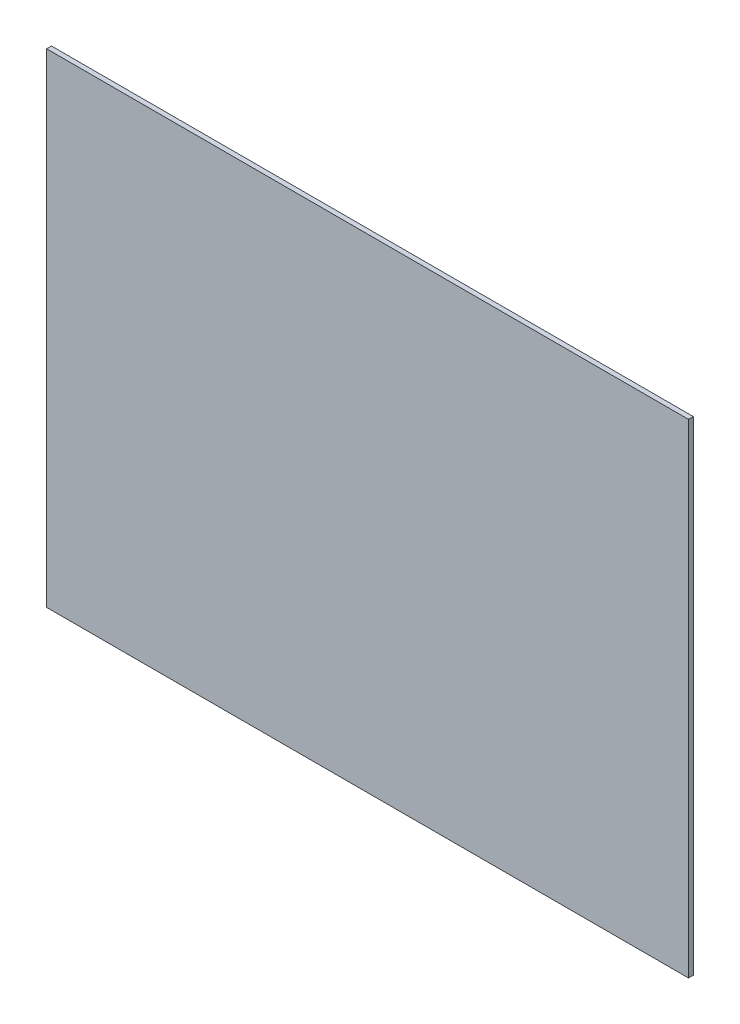
ISO-10303-21;
HEADER;
FILE_DESCRIPTION(('STEP AP214'),'2;1');
FILE_NAME('part.step','',(''),(''),'','','');
FILE_SCHEMA(('AUTOMOTIVE_DESIGN { 1 0 10303 214 1 1 1 1 }'));
ENDSEC;
DATA;
#1=APPLICATION_CONTEXT('core data for automotive mechanical design processes');
#2=APPLICATION_PROTOCOL_DEFINITION('international standard','automotive_design',2000,#1);
#3=PRODUCT_CONTEXT('',#1,'mechanical');
#4=PRODUCT('Part','Part','',(#3));
#5=PRODUCT_RELATED_PRODUCT_CATEGORY('part','',(#4));
#6=PRODUCT_DEFINITION_FORMATION('','',#4);
#7=PRODUCT_DEFINITION_CONTEXT('part definition',#1,'design');
#8=PRODUCT_DEFINITION('design','',#6,#7);
#9=PRODUCT_DEFINITION_SHAPE('','',#8);
#10=(LENGTH_UNIT() NAMED_UNIT(*) SI_UNIT(.MILLI.,.METRE.));
#11=(NAMED_UNIT(*) PLANE_ANGLE_UNIT() SI_UNIT($,.RADIAN.));
#12=(NAMED_UNIT(*) SI_UNIT($,.STERADIAN.) SOLID_ANGLE_UNIT());
#13=UNCERTAINTY_MEASURE_WITH_UNIT(LENGTH_MEASURE(1.E-05),#10,'distance_accuracy_value','');
#14=(GEOMETRIC_REPRESENTATION_CONTEXT(3) GLOBAL_UNCERTAINTY_ASSIGNED_CONTEXT((#13)) GLOBAL_UNIT_ASSIGNED_CONTEXT((#10,
#11,#12)) REPRESENTATION_CONTEXT('',''));
#15=CARTESIAN_POINT('',(0.,0.,0.));
#16=DIRECTION('',(0.,0.,1.));
#17=DIRECTION('',(1.,0.,0.));
#18=AXIS2_PLACEMENT_3D('',#15,#16,#17);
#19=CARTESIAN_POINT('',(199.,150.,3.));
#20=DIRECTION('',(-1.,0.,0.));
#21=DIRECTION('',(0.,-1.,0.));
#22=AXIS2_PLACEMENT_3D('',#19,#20,#21);
#23=PLANE('',#22);
#24=DIRECTION('',(0.,1.,0.));
#25=VECTOR('',#24,1.);
#26=CARTESIAN_POINT('',(199.,150.,0.));
#27=LINE('',#26,#25);
#28=CARTESIAN_POINT('',(199.,-150.,0.));
#29=VERTEX_POINT('',#28);
#30=CARTESIAN_POINT('',(199.,150.,0.));
#31=VERTEX_POINT('',#30);
#32=EDGE_CURVE('E99',#29,#31,#27,.T.);
#33=ORIENTED_EDGE('',*,*,#32,.T.);
#34=DIRECTION('',(0.,0.,-1.));
#35=VECTOR('',#34,1.);
#36=CARTESIAN_POINT('',(199.,150.,3.));
#37=LINE('',#36,#35);
#38=CARTESIAN_POINT('',(199.,150.,3.));
#39=VERTEX_POINT('',#38);
#40=EDGE_CURVE('E11',#39,#31,#37,.T.);
#41=ORIENTED_EDGE('',*,*,#40,.F.);
#42=DIRECTION('',(0.,1.,0.));
#43=VECTOR('',#42,1.);
#44=CARTESIAN_POINT('',(199.,150.,3.));
#45=LINE('',#44,#43);
#46=CARTESIAN_POINT('',(199.,-150.,3.));
#47=VERTEX_POINT('',#46);
#48=EDGE_CURVE('E87',#47,#39,#45,.T.);
#49=ORIENTED_EDGE('',*,*,#48,.F.);
#50=DIRECTION('',(0.,0.,-1.));
#51=VECTOR('',#50,1.);
#52=CARTESIAN_POINT('',(199.,-150.,3.));
#53=LINE('',#52,#51);
#54=EDGE_CURVE('E95',#47,#29,#53,.T.);
#55=ORIENTED_EDGE('',*,*,#54,.T.);
#56=EDGE_LOOP('',(#33,#41,#49,#55));
#57=FACE_BOUND('',#56,.T.);
#58=ADVANCED_FACE('F36',(#57),#23,.F.);
#59=CARTESIAN_POINT('',(-199.,150.,3.));
#60=DIRECTION('',(0.,-1.,0.));
#61=DIRECTION('',(0.,0.,-1.));
#62=AXIS2_PLACEMENT_3D('',#59,#60,#61);
#63=PLANE('',#62);
#64=DIRECTION('',(-1.,0.,0.));
#65=VECTOR('',#64,1.);
#66=CARTESIAN_POINT('',(-199.,150.,0.));
#67=LINE('',#66,#65);
#68=CARTESIAN_POINT('',(-199.,150.,0.));
#69=VERTEX_POINT('',#68);
#70=EDGE_CURVE('E91',#31,#69,#67,.T.);
#71=ORIENTED_EDGE('',*,*,#70,.T.);
#72=DIRECTION('',(0.,0.,-1.));
#73=VECTOR('',#72,1.);
#74=CARTESIAN_POINT('',(-199.,150.,3.));
#75=LINE('',#74,#73);
#76=CARTESIAN_POINT('',(-199.,150.,3.));
#77=VERTEX_POINT('',#76);
#78=EDGE_CURVE('E44',#77,#69,#75,.T.);
#79=ORIENTED_EDGE('',*,*,#78,.F.);
#80=DIRECTION('',(-1.,0.,0.));
#81=VECTOR('',#80,1.);
#82=CARTESIAN_POINT('',(-199.,150.,3.));
#83=LINE('',#82,#81);
#84=EDGE_CURVE('E82',#39,#77,#83,.T.);
#85=ORIENTED_EDGE('',*,*,#84,.F.);
#86=ORIENTED_EDGE('',*,*,#40,.T.);
#87=EDGE_LOOP('',(#71,#79,#85,#86));
#88=FACE_BOUND('',#87,.T.);
#89=ADVANCED_FACE('F90',(#88),#63,.F.);
#90=CARTESIAN_POINT('',(-199.,150.,3.));
#91=DIRECTION('',(1.,0.,0.));
#92=DIRECTION('',(0.,1.,0.));
#93=AXIS2_PLACEMENT_3D('',#90,#91,#92);
#94=PLANE('',#93);
#95=DIRECTION('',(0.,-1.,0.));
#96=VECTOR('',#95,1.);
#97=CARTESIAN_POINT('',(-199.,150.,0.));
#98=LINE('',#97,#96);
#99=CARTESIAN_POINT('',(-199.,-150.,0.));
#100=VERTEX_POINT('',#99);
#101=EDGE_CURVE('E69',#69,#100,#98,.T.);
#102=ORIENTED_EDGE('',*,*,#101,.T.);
#103=DIRECTION('',(0.,0.,-1.));
#104=VECTOR('',#103,1.);
#105=CARTESIAN_POINT('',(-199.,-150.,3.));
#106=LINE('',#105,#104);
#107=CARTESIAN_POINT('',(-199.,-150.,3.));
#108=VERTEX_POINT('',#107);
#109=EDGE_CURVE('E92',#108,#100,#106,.T.);
#110=ORIENTED_EDGE('',*,*,#109,.F.);
#111=DIRECTION('',(0.,-1.,0.));
#112=VECTOR('',#111,1.);
#113=CARTESIAN_POINT('',(-199.,150.,3.));
#114=LINE('',#113,#112);
#115=EDGE_CURVE('E85',#77,#108,#114,.T.);
#116=ORIENTED_EDGE('',*,*,#115,.F.);
#117=ORIENTED_EDGE('',*,*,#78,.T.);
#118=EDGE_LOOP('',(#102,#110,#116,#117));
#119=FACE_BOUND('',#118,.T.);
#120=ADVANCED_FACE('F93',(#119),#94,.F.);
#121=CARTESIAN_POINT('',(-199.,-150.,3.));
#122=DIRECTION('',(0.,1.,0.));
#123=DIRECTION('',(0.,0.,1.));
#124=AXIS2_PLACEMENT_3D('',#121,#122,#123);
#125=PLANE('',#124);
#126=DIRECTION('',(1.,0.,0.));
#127=VECTOR('',#126,1.);
#128=CARTESIAN_POINT('',(-199.,-150.,0.));
#129=LINE('',#128,#127);
#130=EDGE_CURVE('E75',#100,#29,#129,.T.);
#131=ORIENTED_EDGE('',*,*,#130,.T.);
#132=ORIENTED_EDGE('',*,*,#54,.F.);
#133=DIRECTION('',(1.,0.,0.));
#134=VECTOR('',#133,1.);
#135=CARTESIAN_POINT('',(-199.,-150.,3.));
#136=LINE('',#135,#134);
#137=EDGE_CURVE('E52',#108,#47,#136,.T.);
#138=ORIENTED_EDGE('',*,*,#137,.F.);
#139=ORIENTED_EDGE('',*,*,#109,.T.);
#140=EDGE_LOOP('',(#131,#132,#138,#139));
#141=FACE_BOUND('',#140,.T.);
#142=ADVANCED_FACE('F106',(#141),#125,.F.);
#143=CARTESIAN_POINT('',(0.,0.,3.));
#144=DIRECTION('',(0.,0.,1.));
#145=DIRECTION('',(1.,0.,0.));
#146=AXIS2_PLACEMENT_3D('',#143,#144,#145);
#147=PLANE('',#146);
#148=ORIENTED_EDGE('',*,*,#48,.T.);
#149=ORIENTED_EDGE('',*,*,#84,.T.);
#150=ORIENTED_EDGE('',*,*,#115,.T.);
#151=ORIENTED_EDGE('',*,*,#137,.T.);
#152=EDGE_LOOP('',(#148,#149,#150,#151));
#153=FACE_BOUND('',#152,.T.);
#154=ADVANCED_FACE('F83',(#153),#147,.T.);
#155=CARTESIAN_POINT('',(0.,0.,0.));
#156=DIRECTION('',(0.,0.,1.));
#157=DIRECTION('',(1.,0.,0.));
#158=AXIS2_PLACEMENT_3D('',#155,#156,#157);
#159=PLANE('',#158);
#160=ORIENTED_EDGE('',*,*,#32,.F.);
#161=ORIENTED_EDGE('',*,*,#130,.F.);
#162=ORIENTED_EDGE('',*,*,#101,.F.);
#163=ORIENTED_EDGE('',*,*,#70,.F.);
#164=EDGE_LOOP('',(#160,#161,#162,#163));
#165=FACE_BOUND('',#164,.T.);
#166=ADVANCED_FACE('F109',(#165),#159,.F.);
#167=CLOSED_SHELL('',(#58,#89,#120,#142,#154,#166));
#168=MANIFOLD_SOLID_BREP('B2',#167);
#169=ADVANCED_BREP_SHAPE_REPRESENTATION('',(#18,#168),#14);
#170=SHAPE_DEFINITION_REPRESENTATION(#9,#169);
ENDSEC;
END-ISO-10303-21;
